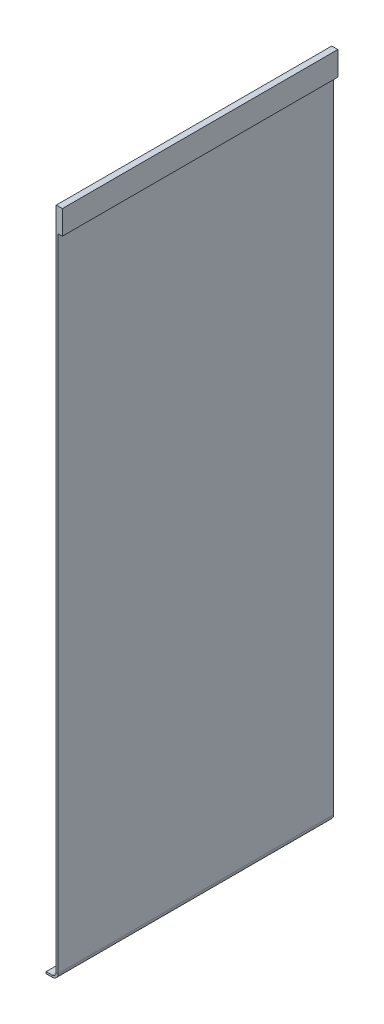
ISO-10303-21;
HEADER;
FILE_DESCRIPTION(('STEP AP214'),'2;1');
FILE_NAME('part.step','',(''),(''),'','','');
FILE_SCHEMA(('AUTOMOTIVE_DESIGN { 1 0 10303 214 1 1 1 1 }'));
ENDSEC;
DATA;
#1=APPLICATION_CONTEXT('core data for automotive mechanical design processes');
#2=APPLICATION_PROTOCOL_DEFINITION('international standard','automotive_design',2000,#1);
#3=PRODUCT_CONTEXT('',#1,'mechanical');
#4=PRODUCT('Part','Part','',(#3));
#5=PRODUCT_RELATED_PRODUCT_CATEGORY('part','',(#4));
#6=PRODUCT_DEFINITION_FORMATION('','',#4);
#7=PRODUCT_DEFINITION_CONTEXT('part definition',#1,'design');
#8=PRODUCT_DEFINITION('design','',#6,#7);
#9=PRODUCT_DEFINITION_SHAPE('','',#8);
#10=(LENGTH_UNIT() NAMED_UNIT(*) SI_UNIT(.MILLI.,.METRE.));
#11=(NAMED_UNIT(*) PLANE_ANGLE_UNIT() SI_UNIT($,.RADIAN.));
#12=(NAMED_UNIT(*) SI_UNIT($,.STERADIAN.) SOLID_ANGLE_UNIT());
#13=UNCERTAINTY_MEASURE_WITH_UNIT(LENGTH_MEASURE(1.E-05),#10,'distance_accuracy_value','');
#14=(GEOMETRIC_REPRESENTATION_CONTEXT(3) GLOBAL_UNCERTAINTY_ASSIGNED_CONTEXT((#13)) GLOBAL_UNIT_ASSIGNED_CONTEXT((#10,
#11,#12)) REPRESENTATION_CONTEXT('',''));
#15=CARTESIAN_POINT('',(0.,0.,0.));
#16=DIRECTION('',(0.,0.,1.));
#17=DIRECTION('',(1.,0.,0.));
#18=AXIS2_PLACEMENT_3D('',#15,#16,#17);
#19=CARTESIAN_POINT('',(0.,0.,0.));
#20=DIRECTION('',(-1.,0.,0.));
#21=DIRECTION('',(0.,0.,1.));
#22=AXIS2_PLACEMENT_3D('',#19,#20,#21);
#23=PLANE('',#22);
#24=DIRECTION('',(0.,0.,1.));
#25=VECTOR('',#24,1.);
#26=CARTESIAN_POINT('',(0.,1.61925,0.));
#27=LINE('',#26,#25);
#28=CARTESIAN_POINT('',(0.,1.61925,0.));
#29=VERTEX_POINT('',#28);
#30=CARTESIAN_POINT('',(0.,1.61925,-73.025));
#31=VERTEX_POINT('',#30);
#32=EDGE_CURVE('E146',#29,#31,#27,.F.);
#33=ORIENTED_EDGE('',*,*,#32,.T.);
#34=DIRECTION('',(0.,1.,0.));
#35=VECTOR('',#34,1.);
#36=CARTESIAN_POINT('',(0.,0.,-73.025));
#37=LINE('',#36,#35);
#38=CARTESIAN_POINT('',(0.,171.45,-73.025));
#39=VERTEX_POINT('',#38);
#40=EDGE_CURVE('E229',#31,#39,#37,.T.);
#41=ORIENTED_EDGE('',*,*,#40,.T.);
#42=DIRECTION('',(0.,0.,-1.));
#43=VECTOR('',#42,1.);
#44=CARTESIAN_POINT('',(0.,171.45,0.));
#45=LINE('',#44,#43);
#46=CARTESIAN_POINT('',(0.,171.45,0.));
#47=VERTEX_POINT('',#46);
#48=EDGE_CURVE('E84',#47,#39,#45,.T.);
#49=ORIENTED_EDGE('',*,*,#48,.F.);
#50=DIRECTION('',(0.,-1.,0.));
#51=VECTOR('',#50,1.);
#52=CARTESIAN_POINT('',(0.,0.,0.));
#53=LINE('',#52,#51);
#54=EDGE_CURVE('E225',#47,#29,#53,.T.);
#55=ORIENTED_EDGE('',*,*,#54,.T.);
#56=EDGE_LOOP('',(#33,#41,#49,#55));
#57=FACE_BOUND('',#56,.T.);
#58=ADVANCED_FACE('F61',(#57),#23,.F.);
#59=CARTESIAN_POINT('',(-0.508,0.,0.));
#60=DIRECTION('',(0.,0.,1.));
#61=DIRECTION('',(1.,0.,0.));
#62=AXIS2_PLACEMENT_3D('',#59,#60,#61);
#63=PLANE('',#62);
#64=DIRECTION('',(0.,-1.,0.));
#65=VECTOR('',#64,1.);
#66=CARTESIAN_POINT('',(-0.508,0.,0.));
#67=LINE('',#66,#65);
#68=CARTESIAN_POINT('',(-0.508,177.8,0.));
#69=VERTEX_POINT('',#68);
#70=CARTESIAN_POINT('',(-0.508,1.61925,0.));
#71=VERTEX_POINT('',#70);
#72=EDGE_CURVE('E226',#69,#71,#67,.T.);
#73=ORIENTED_EDGE('',*,*,#72,.T.);
#74=DIRECTION('',(1.,0.,0.));
#75=VECTOR('',#74,1.);
#76=CARTESIAN_POINT('',(-0.508,1.61925,0.));
#77=LINE('',#76,#75);
#78=EDGE_CURVE('E196',#71,#29,#77,.T.);
#79=ORIENTED_EDGE('',*,*,#78,.T.);
#80=ORIENTED_EDGE('',*,*,#54,.F.);
#81=DIRECTION('',(-1.,0.,0.));
#82=VECTOR('',#81,1.);
#83=CARTESIAN_POINT('',(1.11125,171.45,0.));
#84=LINE('',#83,#82);
#85=CARTESIAN_POINT('',(1.11125,171.45,0.));
#86=VERTEX_POINT('',#85);
#87=EDGE_CURVE('E222',#86,#47,#84,.T.);
#88=ORIENTED_EDGE('',*,*,#87,.F.);
#89=DIRECTION('',(0.,-1.,0.));
#90=VECTOR('',#89,1.);
#91=CARTESIAN_POINT('',(1.11125,177.8,0.));
#92=LINE('',#91,#90);
#93=CARTESIAN_POINT('',(1.11125,177.8,0.));
#94=VERTEX_POINT('',#93);
#95=EDGE_CURVE('E207',#94,#86,#92,.T.);
#96=ORIENTED_EDGE('',*,*,#95,.F.);
#97=DIRECTION('',(1.,0.,0.));
#98=VECTOR('',#97,1.);
#99=CARTESIAN_POINT('',(-0.508,177.8,0.));
#100=LINE('',#99,#98);
#101=EDGE_CURVE('E13',#69,#94,#100,.T.);
#102=ORIENTED_EDGE('',*,*,#101,.F.);
#103=EDGE_LOOP('',(#73,#79,#80,#88,#96,#102));
#104=FACE_BOUND('',#103,.T.);
#105=ADVANCED_FACE('F63',(#104),#63,.T.);
#106=CARTESIAN_POINT('',(-0.508,0.,0.));
#107=DIRECTION('',(-1.,0.,0.));
#108=DIRECTION('',(0.,0.,1.));
#109=AXIS2_PLACEMENT_3D('',#106,#107,#108);
#110=PLANE('',#109);
#111=DIRECTION('',(0.,1.,0.));
#112=VECTOR('',#111,1.);
#113=CARTESIAN_POINT('',(-0.508,0.,-73.025));
#114=LINE('',#113,#112);
#115=CARTESIAN_POINT('',(-0.508,1.61925,-73.025));
#116=VERTEX_POINT('',#115);
#117=CARTESIAN_POINT('',(-0.508,177.8,-73.025));
#118=VERTEX_POINT('',#117);
#119=EDGE_CURVE('E228',#116,#118,#114,.T.);
#120=ORIENTED_EDGE('',*,*,#119,.F.);
#121=DIRECTION('',(0.,0.,1.));
#122=VECTOR('',#121,1.);
#123=CARTESIAN_POINT('',(-0.508,1.61925,0.));
#124=LINE('',#123,#122);
#125=EDGE_CURVE('E76',#71,#116,#124,.F.);
#126=ORIENTED_EDGE('',*,*,#125,.F.);
#127=ORIENTED_EDGE('',*,*,#72,.F.);
#128=DIRECTION('',(0.,0.,1.));
#129=VECTOR('',#128,1.);
#130=CARTESIAN_POINT('',(-0.508,177.8,0.));
#131=LINE('',#130,#129);
#132=EDGE_CURVE('E231',#118,#69,#131,.T.);
#133=ORIENTED_EDGE('',*,*,#132,.F.);
#134=EDGE_LOOP('',(#120,#126,#127,#133));
#135=FACE_BOUND('',#134,.T.);
#136=ADVANCED_FACE('F252',(#135),#110,.T.);
#137=CARTESIAN_POINT('',(-0.508,177.8,0.));
#138=DIRECTION('',(0.,1.,0.));
#139=DIRECTION('',(0.,0.,1.));
#140=AXIS2_PLACEMENT_3D('',#137,#138,#139);
#141=PLANE('',#140);
#142=ORIENTED_EDGE('',*,*,#101,.T.);
#143=DIRECTION('',(0.,0.,1.));
#144=VECTOR('',#143,1.);
#145=CARTESIAN_POINT('',(1.11125,177.8,0.));
#146=LINE('',#145,#144);
#147=CARTESIAN_POINT('',(1.11125,177.8,-73.025));
#148=VERTEX_POINT('',#147);
#149=EDGE_CURVE('E215',#148,#94,#146,.T.);
#150=ORIENTED_EDGE('',*,*,#149,.F.);
#151=DIRECTION('',(1.,0.,0.));
#152=VECTOR('',#151,1.);
#153=CARTESIAN_POINT('',(-0.508,177.8,-73.025));
#154=LINE('',#153,#152);
#155=EDGE_CURVE('E65',#118,#148,#154,.T.);
#156=ORIENTED_EDGE('',*,*,#155,.F.);
#157=ORIENTED_EDGE('',*,*,#132,.T.);
#158=EDGE_LOOP('',(#142,#150,#156,#157));
#159=FACE_BOUND('',#158,.T.);
#160=ADVANCED_FACE('F249',(#159),#141,.T.);
#161=CARTESIAN_POINT('',(-0.508,0.,-73.025));
#162=DIRECTION('',(0.,0.,-1.));
#163=DIRECTION('',(-1.,0.,0.));
#164=AXIS2_PLACEMENT_3D('',#161,#162,#163);
#165=PLANE('',#164);
#166=DIRECTION('',(1.,0.,0.));
#167=VECTOR('',#166,1.);
#168=CARTESIAN_POINT('',(-0.508,1.61925,-73.025));
#169=LINE('',#168,#167);
#170=EDGE_CURVE('E202',#116,#31,#169,.T.);
#171=ORIENTED_EDGE('',*,*,#170,.F.);
#172=ORIENTED_EDGE('',*,*,#119,.T.);
#173=ORIENTED_EDGE('',*,*,#155,.T.);
#174=DIRECTION('',(0.,1.,0.));
#175=VECTOR('',#174,1.);
#176=CARTESIAN_POINT('',(1.11125,177.8,-73.025));
#177=LINE('',#176,#175);
#178=CARTESIAN_POINT('',(1.11125,171.45,-73.025));
#179=VERTEX_POINT('',#178);
#180=EDGE_CURVE('E212',#179,#148,#177,.T.);
#181=ORIENTED_EDGE('',*,*,#180,.F.);
#182=DIRECTION('',(-1.,0.,0.));
#183=VECTOR('',#182,1.);
#184=CARTESIAN_POINT('',(1.11125,171.45,-73.025));
#185=LINE('',#184,#183);
#186=EDGE_CURVE('E218',#179,#39,#185,.T.);
#187=ORIENTED_EDGE('',*,*,#186,.T.);
#188=ORIENTED_EDGE('',*,*,#40,.F.);
#189=EDGE_LOOP('',(#171,#172,#173,#181,#187,#188));
#190=FACE_BOUND('',#189,.T.);
#191=ADVANCED_FACE('F242',(#190),#165,.T.);
#192=CARTESIAN_POINT('',(1.11125,171.45,0.));
#193=DIRECTION('',(0.,1.,0.));
#194=DIRECTION('',(0.,0.,1.));
#195=AXIS2_PLACEMENT_3D('',#192,#193,#194);
#196=PLANE('',#195);
#197=ORIENTED_EDGE('',*,*,#48,.T.);
#198=ORIENTED_EDGE('',*,*,#186,.F.);
#199=DIRECTION('',(0.,0.,-1.));
#200=VECTOR('',#199,1.);
#201=CARTESIAN_POINT('',(1.11125,171.45,0.));
#202=LINE('',#201,#200);
#203=EDGE_CURVE('E210',#86,#179,#202,.T.);
#204=ORIENTED_EDGE('',*,*,#203,.F.);
#205=ORIENTED_EDGE('',*,*,#87,.T.);
#206=EDGE_LOOP('',(#197,#198,#204,#205));
#207=FACE_BOUND('',#206,.T.);
#208=ADVANCED_FACE('F239',(#207),#196,.F.);
#209=CARTESIAN_POINT('',(1.11125,0.,0.));
#210=DIRECTION('',(1.,0.,0.));
#211=DIRECTION('',(0.,0.,-1.));
#212=AXIS2_PLACEMENT_3D('',#209,#210,#211);
#213=PLANE('',#212);
#214=ORIENTED_EDGE('',*,*,#95,.T.);
#215=ORIENTED_EDGE('',*,*,#203,.T.);
#216=ORIENTED_EDGE('',*,*,#180,.T.);
#217=ORIENTED_EDGE('',*,*,#149,.T.);
#218=EDGE_LOOP('',(#214,#215,#216,#217));
#219=FACE_BOUND('',#218,.T.);
#220=ADVANCED_FACE('F246',(#219),#213,.T.);
#221=CARTESIAN_POINT('',(-1.61925,1.61925,-73.025));
#222=DIRECTION('',(0.,0.,-1.));
#223=DIRECTION('',(-1.,0.,0.));
#224=AXIS2_PLACEMENT_3D('',#221,#222,#223);
#225=PLANE('',#224);
#226=DIRECTION('',(0.,-1.,0.));
#227=VECTOR('',#226,1.);
#228=CARTESIAN_POINT('',(-1.61924999999999,0.,-73.025));
#229=LINE('',#228,#227);
#230=CARTESIAN_POINT('',(-1.61925,0.507999999999996,-73.025));
#231=VERTEX_POINT('',#230);
#232=CARTESIAN_POINT('',(-1.61924999999999,0.,-73.025));
#233=VERTEX_POINT('',#232);
#234=EDGE_CURVE('E191',#231,#233,#229,.T.);
#235=ORIENTED_EDGE('',*,*,#234,.F.);
#236=CARTESIAN_POINT('',(-1.61925,1.61925,-73.025));
#237=DIRECTION('',(0.,0.,1.));
#238=DIRECTION('',(1.,0.,0.));
#239=AXIS2_PLACEMENT_3D('',#236,#237,#238);
#240=CIRCLE('',#239,1.11125);
#241=EDGE_CURVE('E149',#116,#231,#240,.F.);
#242=ORIENTED_EDGE('',*,*,#241,.F.);
#243=ORIENTED_EDGE('',*,*,#170,.T.);
#244=CARTESIAN_POINT('',(-1.61925,1.61925,-73.025));
#245=DIRECTION('',(0.,0.,1.));
#246=DIRECTION('',(1.,0.,0.));
#247=AXIS2_PLACEMENT_3D('',#244,#245,#246);
#248=CIRCLE('',#247,1.61925);
#249=EDGE_CURVE('E195',#31,#233,#248,.F.);
#250=ORIENTED_EDGE('',*,*,#249,.T.);
#251=EDGE_LOOP('',(#235,#242,#243,#250));
#252=FACE_BOUND('',#251,.T.);
#253=ADVANCED_FACE('F258',(#252),#225,.T.);
#254=CARTESIAN_POINT('',(-1.61925,1.61925,0.));
#255=DIRECTION('',(0.,0.,-1.));
#256=DIRECTION('',(-1.,0.,0.));
#257=AXIS2_PLACEMENT_3D('',#254,#255,#256);
#258=PLANE('',#257);
#259=CARTESIAN_POINT('',(-1.61925,1.61925,0.));
#260=DIRECTION('',(0.,0.,1.));
#261=DIRECTION('',(1.,0.,0.));
#262=AXIS2_PLACEMENT_3D('',#259,#260,#261);
#263=CIRCLE('',#262,1.11125);
#264=CARTESIAN_POINT('',(-1.61925,0.507999999999996,0.));
#265=VERTEX_POINT('',#264);
#266=EDGE_CURVE('E156',#265,#71,#263,.T.);
#267=ORIENTED_EDGE('',*,*,#266,.F.);
#268=DIRECTION('',(0.,-1.,0.));
#269=VECTOR('',#268,1.);
#270=CARTESIAN_POINT('',(-1.61925,0.507999999999996,0.));
#271=LINE('',#270,#269);
#272=CARTESIAN_POINT('',(-1.61924999999999,0.,0.));
#273=VERTEX_POINT('',#272);
#274=EDGE_CURVE('E153',#265,#273,#271,.T.);
#275=ORIENTED_EDGE('',*,*,#274,.T.);
#276=CARTESIAN_POINT('',(-1.61925,1.61925,0.));
#277=DIRECTION('',(0.,0.,1.));
#278=DIRECTION('',(1.,0.,0.));
#279=AXIS2_PLACEMENT_3D('',#276,#277,#278);
#280=CIRCLE('',#279,1.61925);
#281=EDGE_CURVE('E139',#273,#29,#280,.T.);
#282=ORIENTED_EDGE('',*,*,#281,.T.);
#283=ORIENTED_EDGE('',*,*,#78,.F.);
#284=EDGE_LOOP('',(#267,#275,#282,#283));
#285=FACE_BOUND('',#284,.T.);
#286=ADVANCED_FACE('F154',(#285),#258,.F.);
#287=CARTESIAN_POINT('',(-1.61925,1.61925,0.));
#288=DIRECTION('',(0.,0.,1.));
#289=DIRECTION('',(0.,-1.,0.));
#290=AXIS2_PLACEMENT_3D('',#287,#288,#289);
#291=CYLINDRICAL_SURFACE('',#290,1.61925);
#292=ORIENTED_EDGE('',*,*,#32,.F.);
#293=ORIENTED_EDGE('',*,*,#281,.F.);
#294=DIRECTION('',(0.,0.,1.));
#295=VECTOR('',#294,1.);
#296=CARTESIAN_POINT('',(-1.61924999999999,0.,0.));
#297=LINE('',#296,#295);
#298=EDGE_CURVE('E144',#233,#273,#297,.T.);
#299=ORIENTED_EDGE('',*,*,#298,.F.);
#300=ORIENTED_EDGE('',*,*,#249,.F.);
#301=EDGE_LOOP('',(#292,#293,#299,#300));
#302=FACE_BOUND('',#301,.T.);
#303=ADVANCED_FACE('F141',(#302),#291,.T.);
#304=CARTESIAN_POINT('',(-1.61925,1.61925,0.));
#305=DIRECTION('',(0.,0.,1.));
#306=DIRECTION('',(0.,-1.,0.));
#307=AXIS2_PLACEMENT_3D('',#304,#305,#306);
#308=CYLINDRICAL_SURFACE('',#307,1.11125);
#309=ORIENTED_EDGE('',*,*,#125,.T.);
#310=ORIENTED_EDGE('',*,*,#241,.T.);
#311=DIRECTION('',(0.,0.,-1.));
#312=VECTOR('',#311,1.);
#313=CARTESIAN_POINT('',(-1.61925,0.507999999999996,-73.025));
#314=LINE('',#313,#312);
#315=EDGE_CURVE('E161',#231,#265,#314,.F.);
#316=ORIENTED_EDGE('',*,*,#315,.T.);
#317=ORIENTED_EDGE('',*,*,#266,.T.);
#318=EDGE_LOOP('',(#309,#310,#316,#317));
#319=FACE_BOUND('',#318,.T.);
#320=ADVANCED_FACE('F255',(#319),#308,.F.);
#321=CARTESIAN_POINT('',(-0.507999999999998,0.,0.));
#322=DIRECTION('',(0.,0.,1.));
#323=DIRECTION('',(1.,0.,0.));
#324=AXIS2_PLACEMENT_3D('',#321,#322,#323);
#325=PLANE('',#324);
#326=DIRECTION('',(1.,0.,0.));
#327=VECTOR('',#326,1.);
#328=CARTESIAN_POINT('',(-0.507999999999998,0.,0.));
#329=LINE('',#328,#327);
#330=CARTESIAN_POINT('',(-3.175,0.,0.));
#331=VERTEX_POINT('',#330);
#332=EDGE_CURVE('E168',#331,#273,#329,.T.);
#333=ORIENTED_EDGE('',*,*,#332,.T.);
#334=ORIENTED_EDGE('',*,*,#274,.F.);
#335=DIRECTION('',(-1.,0.,0.));
#336=VECTOR('',#335,1.);
#337=CARTESIAN_POINT('',(0.,0.508000000000002,0.));
#338=LINE('',#337,#336);
#339=CARTESIAN_POINT('',(-3.175,0.507999999999991,0.));
#340=VERTEX_POINT('',#339);
#341=EDGE_CURVE('E184',#340,#265,#338,.F.);
#342=ORIENTED_EDGE('',*,*,#341,.F.);
#343=DIRECTION('',(0.,1.,0.));
#344=VECTOR('',#343,1.);
#345=CARTESIAN_POINT('',(-3.175,0.,0.));
#346=LINE('',#345,#344);
#347=EDGE_CURVE('E173',#331,#340,#346,.T.);
#348=ORIENTED_EDGE('',*,*,#347,.F.);
#349=EDGE_LOOP('',(#333,#334,#342,#348));
#350=FACE_BOUND('',#349,.T.);
#351=ADVANCED_FACE('F172',(#350),#325,.T.);
#352=CARTESIAN_POINT('',(-3.175,0.,-73.025));
#353=DIRECTION('',(0.,0.,-1.));
#354=DIRECTION('',(-1.,0.,0.));
#355=AXIS2_PLACEMENT_3D('',#352,#353,#354);
#356=PLANE('',#355);
#357=DIRECTION('',(1.,0.,0.));
#358=VECTOR('',#357,1.);
#359=CARTESIAN_POINT('',(0.,0.508000000000002,-73.025));
#360=LINE('',#359,#358);
#361=CARTESIAN_POINT('',(-3.175,0.507999999999991,-73.025));
#362=VERTEX_POINT('',#361);
#363=EDGE_CURVE('E170',#231,#362,#360,.F.);
#364=ORIENTED_EDGE('',*,*,#363,.F.);
#365=ORIENTED_EDGE('',*,*,#234,.T.);
#366=DIRECTION('',(-1.,0.,0.));
#367=VECTOR('',#366,1.);
#368=CARTESIAN_POINT('',(-3.175,0.,-73.025));
#369=LINE('',#368,#367);
#370=CARTESIAN_POINT('',(-3.175,0.,-73.025));
#371=VERTEX_POINT('',#370);
#372=EDGE_CURVE('E169',#233,#371,#369,.T.);
#373=ORIENTED_EDGE('',*,*,#372,.T.);
#374=DIRECTION('',(0.,1.,0.));
#375=VECTOR('',#374,1.);
#376=CARTESIAN_POINT('',(-3.175,0.,-73.025));
#377=LINE('',#376,#375);
#378=EDGE_CURVE('E175',#371,#362,#377,.T.);
#379=ORIENTED_EDGE('',*,*,#378,.T.);
#380=EDGE_LOOP('',(#364,#365,#373,#379));
#381=FACE_BOUND('',#380,.T.);
#382=ADVANCED_FACE('F261',(#381),#356,.T.);
#383=CARTESIAN_POINT('',(0.,0.,0.));
#384=DIRECTION('',(0.,-1.,0.));
#385=DIRECTION('',(1.,0.,0.));
#386=AXIS2_PLACEMENT_3D('',#383,#384,#385);
#387=PLANE('',#386);
#388=ORIENTED_EDGE('',*,*,#372,.F.);
#389=ORIENTED_EDGE('',*,*,#298,.T.);
#390=ORIENTED_EDGE('',*,*,#332,.F.);
#391=DIRECTION('',(0.,0.,1.));
#392=VECTOR('',#391,1.);
#393=CARTESIAN_POINT('',(-3.175,0.,0.));
#394=LINE('',#393,#392);
#395=EDGE_CURVE('E176',#371,#331,#394,.T.);
#396=ORIENTED_EDGE('',*,*,#395,.F.);
#397=EDGE_LOOP('',(#388,#389,#390,#396));
#398=FACE_BOUND('',#397,.T.);
#399=ADVANCED_FACE('F166',(#398),#387,.T.);
#400=CARTESIAN_POINT('',(0.,0.508000000000002,0.));
#401=DIRECTION('',(0.,-1.,0.));
#402=DIRECTION('',(1.,0.,0.));
#403=AXIS2_PLACEMENT_3D('',#400,#401,#402);
#404=PLANE('',#403);
#405=ORIENTED_EDGE('',*,*,#315,.F.);
#406=ORIENTED_EDGE('',*,*,#363,.T.);
#407=DIRECTION('',(0.,0.,-1.));
#408=VECTOR('',#407,1.);
#409=CARTESIAN_POINT('',(-3.175,0.507999999999991,0.));
#410=LINE('',#409,#408);
#411=EDGE_CURVE('E186',#362,#340,#410,.F.);
#412=ORIENTED_EDGE('',*,*,#411,.T.);
#413=ORIENTED_EDGE('',*,*,#341,.T.);
#414=EDGE_LOOP('',(#405,#406,#412,#413));
#415=FACE_BOUND('',#414,.T.);
#416=ADVANCED_FACE('F265',(#415),#404,.F.);
#417=CARTESIAN_POINT('',(-3.175,0.,0.));
#418=DIRECTION('',(-1.,0.,0.));
#419=DIRECTION('',(0.,-1.,0.));
#420=AXIS2_PLACEMENT_3D('',#417,#418,#419);
#421=PLANE('',#420);
#422=ORIENTED_EDGE('',*,*,#411,.F.);
#423=ORIENTED_EDGE('',*,*,#378,.F.);
#424=ORIENTED_EDGE('',*,*,#395,.T.);
#425=ORIENTED_EDGE('',*,*,#347,.T.);
#426=EDGE_LOOP('',(#422,#423,#424,#425));
#427=FACE_BOUND('',#426,.T.);
#428=ADVANCED_FACE('F267',(#427),#421,.T.);
#429=CLOSED_SHELL('',(#58,#105,#136,#160,#191,#208,#220,#253,#286,#303,#320,#351,#382,#399,#416,#428));
#430=MANIFOLD_SOLID_BREP('B2',#429);
#431=ADVANCED_BREP_SHAPE_REPRESENTATION('',(#18,#430),#14);
#432=SHAPE_DEFINITION_REPRESENTATION(#9,#431);
ENDSEC;
END-ISO-10303-21;
